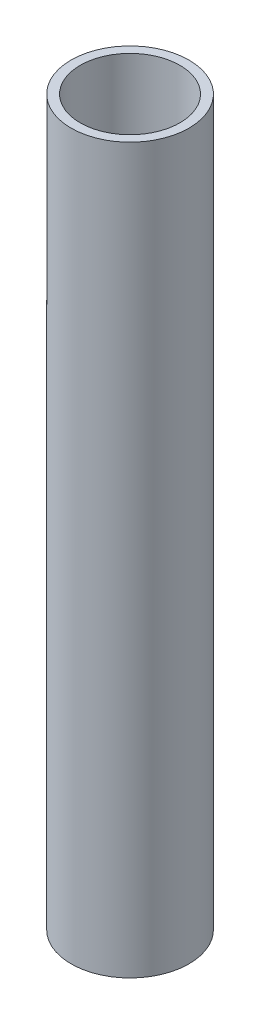
ISO-10303-21;
HEADER;
FILE_DESCRIPTION(('STEP AP214'),'2;1');
FILE_NAME('part.step','',(''),(''),'','','');
FILE_SCHEMA(('AUTOMOTIVE_DESIGN { 1 0 10303 214 1 1 1 1 }'));
ENDSEC;
DATA;
#1=APPLICATION_CONTEXT('core data for automotive mechanical design processes');
#2=APPLICATION_PROTOCOL_DEFINITION('international standard','automotive_design',2000,#1);
#3=PRODUCT_CONTEXT('',#1,'mechanical');
#4=PRODUCT('Part','Part','',(#3));
#5=PRODUCT_RELATED_PRODUCT_CATEGORY('part','',(#4));
#6=PRODUCT_DEFINITION_FORMATION('','',#4);
#7=PRODUCT_DEFINITION_CONTEXT('part definition',#1,'design');
#8=PRODUCT_DEFINITION('design','',#6,#7);
#9=PRODUCT_DEFINITION_SHAPE('','',#8);
#10=(LENGTH_UNIT() NAMED_UNIT(*) SI_UNIT(.MILLI.,.METRE.));
#11=(NAMED_UNIT(*) PLANE_ANGLE_UNIT() SI_UNIT($,.RADIAN.));
#12=(NAMED_UNIT(*) SI_UNIT($,.STERADIAN.) SOLID_ANGLE_UNIT());
#13=UNCERTAINTY_MEASURE_WITH_UNIT(LENGTH_MEASURE(1.E-05),#10,'distance_accuracy_value','');
#14=(GEOMETRIC_REPRESENTATION_CONTEXT(3) GLOBAL_UNCERTAINTY_ASSIGNED_CONTEXT((#13)) GLOBAL_UNIT_ASSIGNED_CONTEXT((#10,
#11,#12)) REPRESENTATION_CONTEXT('',''));
#15=CARTESIAN_POINT('',(0.,0.,0.));
#16=DIRECTION('',(0.,0.,1.));
#17=DIRECTION('',(1.,0.,0.));
#18=AXIS2_PLACEMENT_3D('',#15,#16,#17);
#19=CARTESIAN_POINT('',(0.,16.,0.));
#20=DIRECTION('',(0.,1.,0.));
#21=DIRECTION('',(0.,0.,1.));
#22=AXIS2_PLACEMENT_3D('',#19,#20,#21);
#23=PLANE('',#22);
#24=CARTESIAN_POINT('',(0.,16.,0.));
#25=DIRECTION('',(0.,1.,0.));
#26=DIRECTION('',(0.,0.,1.));
#27=AXIS2_PLACEMENT_3D('',#24,#25,#26);
#28=CIRCLE('',#27,3.75);
#29=CARTESIAN_POINT('',(0.,16.,3.75));
#30=VERTEX_POINT('',#29);
#31=EDGE_CURVE('E10',#30,#30,#28,.F.);
#32=ORIENTED_EDGE('',*,*,#31,.T.);
#33=EDGE_LOOP('',(#32));
#34=FACE_BOUND('',#33,.T.);
#35=CARTESIAN_POINT('',(0.,16.,0.));
#36=DIRECTION('',(0.,1.,0.));
#37=DIRECTION('',(0.,0.,1.));
#38=AXIS2_PLACEMENT_3D('',#35,#36,#37);
#39=CIRCLE('',#38,4.65);
#40=CARTESIAN_POINT('',(0.,16.,4.65));
#41=VERTEX_POINT('',#40);
#42=EDGE_CURVE('E51',#41,#41,#39,.F.);
#43=ORIENTED_EDGE('',*,*,#42,.F.);
#44=EDGE_LOOP('',(#43));
#45=FACE_BOUND('',#44,.T.);
#46=ADVANCED_FACE('F31',(#34,#45),#23,.T.);
#47=CARTESIAN_POINT('',(0.,16.,0.));
#48=DIRECTION('',(0.,-1.,0.));
#49=DIRECTION('',(0.,0.,-1.));
#50=AXIS2_PLACEMENT_3D('',#47,#48,#49);
#51=CYLINDRICAL_SURFACE('',#50,5.5);
#52=CARTESIAN_POINT('',(0.,-1.5,0.));
#53=DIRECTION('',(0.,-1.,0.));
#54=DIRECTION('',(0.,0.,-1.));
#55=AXIS2_PLACEMENT_3D('',#52,#53,#54);
#56=CIRCLE('',#55,5.5);
#57=CARTESIAN_POINT('',(0.,-1.5,-5.5));
#58=VERTEX_POINT('',#57);
#59=EDGE_CURVE('E54',#58,#58,#56,.T.);
#60=ORIENTED_EDGE('',*,*,#59,.F.);
#61=EDGE_LOOP('',(#60));
#62=FACE_BOUND('',#61,.T.);
#63=CARTESIAN_POINT('',(0.,66.,0.));
#64=DIRECTION('',(0.,1.,0.));
#65=DIRECTION('',(0.,0.,1.));
#66=AXIS2_PLACEMENT_3D('',#63,#64,#65);
#67=CIRCLE('',#66,5.5);
#68=CARTESIAN_POINT('',(0.,66.,5.5));
#69=VERTEX_POINT('',#68);
#70=EDGE_CURVE('E60',#69,#69,#67,.T.);
#71=ORIENTED_EDGE('',*,*,#70,.F.);
#72=EDGE_LOOP('',(#71));
#73=FACE_BOUND('',#72,.T.);
#74=ADVANCED_FACE('F85',(#62,#73),#51,.T.);
#75=CARTESIAN_POINT('',(0.,16.,0.));
#76=DIRECTION('',(0.,-1.,0.));
#77=DIRECTION('',(0.,0.,-1.));
#78=AXIS2_PLACEMENT_3D('',#75,#76,#77);
#79=CYLINDRICAL_SURFACE('',#78,2.75);
#80=CARTESIAN_POINT('',(0.,15.,0.));
#81=DIRECTION('',(0.,1.,0.));
#82=DIRECTION('',(0.,0.,1.));
#83=AXIS2_PLACEMENT_3D('',#80,#81,#82);
#84=CIRCLE('',#83,2.75);
#85=CARTESIAN_POINT('',(0.,15.,2.75));
#86=VERTEX_POINT('',#85);
#87=EDGE_CURVE('E38',#86,#86,#84,.T.);
#88=ORIENTED_EDGE('',*,*,#87,.T.);
#89=EDGE_LOOP('',(#88));
#90=FACE_BOUND('',#89,.T.);
#91=CARTESIAN_POINT('',(0.,2.00000000000001,0.));
#92=DIRECTION('',(0.,-1.,0.));
#93=DIRECTION('',(0.,0.,-1.));
#94=AXIS2_PLACEMENT_3D('',#91,#92,#93);
#95=CIRCLE('',#94,2.75);
#96=CARTESIAN_POINT('',(0.,2.00000000000001,-2.75));
#97=VERTEX_POINT('',#96);
#98=EDGE_CURVE('E46',#97,#97,#95,.T.);
#99=ORIENTED_EDGE('',*,*,#98,.T.);
#100=EDGE_LOOP('',(#99));
#101=FACE_BOUND('',#100,.T.);
#102=ADVANCED_FACE('F90',(#90,#101),#79,.F.);
#103=CARTESIAN_POINT('',(0.,-1.5,0.));
#104=DIRECTION('',(0.,-1.,0.));
#105=DIRECTION('',(0.,0.,-1.));
#106=AXIS2_PLACEMENT_3D('',#103,#104,#105);
#107=PLANE('',#106);
#108=ORIENTED_EDGE('',*,*,#59,.T.);
#109=EDGE_LOOP('',(#108));
#110=FACE_BOUND('',#109,.T.);
#111=CARTESIAN_POINT('',(0.,-1.5,0.));
#112=DIRECTION('',(0.,-1.,0.));
#113=DIRECTION('',(0.,0.,-1.));
#114=AXIS2_PLACEMENT_3D('',#111,#112,#113);
#115=CIRCLE('',#114,1.);
#116=CARTESIAN_POINT('',(0.,-1.5,-1.));
#117=VERTEX_POINT('',#116);
#118=EDGE_CURVE('E57',#117,#117,#115,.T.);
#119=ORIENTED_EDGE('',*,*,#118,.F.);
#120=EDGE_LOOP('',(#119));
#121=FACE_BOUND('',#120,.T.);
#122=ADVANCED_FACE('F81',(#110,#121),#107,.T.);
#123=CARTESIAN_POINT('',(0.,-1.5,0.));
#124=DIRECTION('',(0.,1.,0.));
#125=DIRECTION('',(0.,0.,1.));
#126=AXIS2_PLACEMENT_3D('',#123,#124,#125);
#127=CYLINDRICAL_SURFACE('',#126,1.);
#128=CARTESIAN_POINT('',(0.,0.250000000000033,0.));
#129=DIRECTION('',(0.,1.,0.));
#130=DIRECTION('',(0.,0.,1.));
#131=AXIS2_PLACEMENT_3D('',#128,#129,#130);
#132=CIRCLE('',#131,1.);
#133=CARTESIAN_POINT('',(0.,0.250000000000033,1.));
#134=VERTEX_POINT('',#133);
#135=EDGE_CURVE('E42',#134,#134,#132,.T.);
#136=ORIENTED_EDGE('',*,*,#135,.T.);
#137=EDGE_LOOP('',(#136));
#138=FACE_BOUND('',#137,.T.);
#139=ORIENTED_EDGE('',*,*,#118,.T.);
#140=EDGE_LOOP('',(#139));
#141=FACE_BOUND('',#140,.T.);
#142=ADVANCED_FACE('F72',(#138,#141),#127,.F.);
#143=CARTESIAN_POINT('',(0.,66.,0.));
#144=DIRECTION('',(0.,1.,0.));
#145=DIRECTION('',(0.,0.,1.));
#146=AXIS2_PLACEMENT_3D('',#143,#144,#145);
#147=PLANE('',#146);
#148=ORIENTED_EDGE('',*,*,#70,.T.);
#149=EDGE_LOOP('',(#148));
#150=FACE_BOUND('',#149,.T.);
#151=CARTESIAN_POINT('',(0.,66.,0.));
#152=DIRECTION('',(0.,1.,0.));
#153=DIRECTION('',(0.,0.,1.));
#154=AXIS2_PLACEMENT_3D('',#151,#152,#153);
#155=CIRCLE('',#154,4.65);
#156=CARTESIAN_POINT('',(0.,66.,4.65));
#157=VERTEX_POINT('',#156);
#158=EDGE_CURVE('E63',#157,#157,#155,.T.);
#159=ORIENTED_EDGE('',*,*,#158,.F.);
#160=EDGE_LOOP('',(#159));
#161=FACE_BOUND('',#160,.T.);
#162=ADVANCED_FACE('F70',(#150,#161),#147,.T.);
#163=CARTESIAN_POINT('',(0.,66.,0.));
#164=DIRECTION('',(0.,-1.,0.));
#165=DIRECTION('',(0.,0.,-1.));
#166=AXIS2_PLACEMENT_3D('',#163,#164,#165);
#167=CYLINDRICAL_SURFACE('',#166,4.65);
#168=ORIENTED_EDGE('',*,*,#158,.T.);
#169=EDGE_LOOP('',(#168));
#170=FACE_BOUND('',#169,.T.);
#171=ORIENTED_EDGE('',*,*,#42,.T.);
#172=EDGE_LOOP('',(#171));
#173=FACE_BOUND('',#172,.T.);
#174=ADVANCED_FACE('F67',(#170,#173),#167,.F.);
#175=CARTESIAN_POINT('',(0.,0.,0.));
#176=DIRECTION('',(0.,1.,0.));
#177=DIRECTION('',(0.,0.,1.));
#178=AXIS2_PLACEMENT_3D('',#175,#176,#177);
#179=CONICAL_SURFACE('',#178,0.749999999999965,0.785398163397454);
#180=ORIENTED_EDGE('',*,*,#98,.F.);
#181=EDGE_LOOP('',(#180));
#182=FACE_BOUND('',#181,.T.);
#183=ORIENTED_EDGE('',*,*,#135,.F.);
#184=EDGE_LOOP('',(#183));
#185=FACE_BOUND('',#184,.T.);
#186=ADVANCED_FACE('F79',(#182,#185),#179,.F.);
#187=CARTESIAN_POINT('',(0.,15.,0.));
#188=DIRECTION('',(0.,1.,0.));
#189=DIRECTION('',(0.,0.,1.));
#190=AXIS2_PLACEMENT_3D('',#187,#188,#189);
#191=TOROIDAL_SURFACE('',#190,3.75,1.);
#192=ORIENTED_EDGE('',*,*,#31,.F.);
#193=EDGE_LOOP('',(#192));
#194=FACE_BOUND('',#193,.T.);
#195=ORIENTED_EDGE('',*,*,#87,.F.);
#196=EDGE_LOOP('',(#195));
#197=FACE_BOUND('',#196,.T.);
#198=ADVANCED_FACE('F33',(#194,#197),#191,.T.);
#199=CLOSED_SHELL('',(#46,#74,#102,#122,#142,#162,#174,#186,#198));
#200=MANIFOLD_SOLID_BREP('B2',#199);
#201=ADVANCED_BREP_SHAPE_REPRESENTATION('',(#18,#200),#14);
#202=SHAPE_DEFINITION_REPRESENTATION(#9,#201);
ENDSEC;
END-ISO-10303-21;
